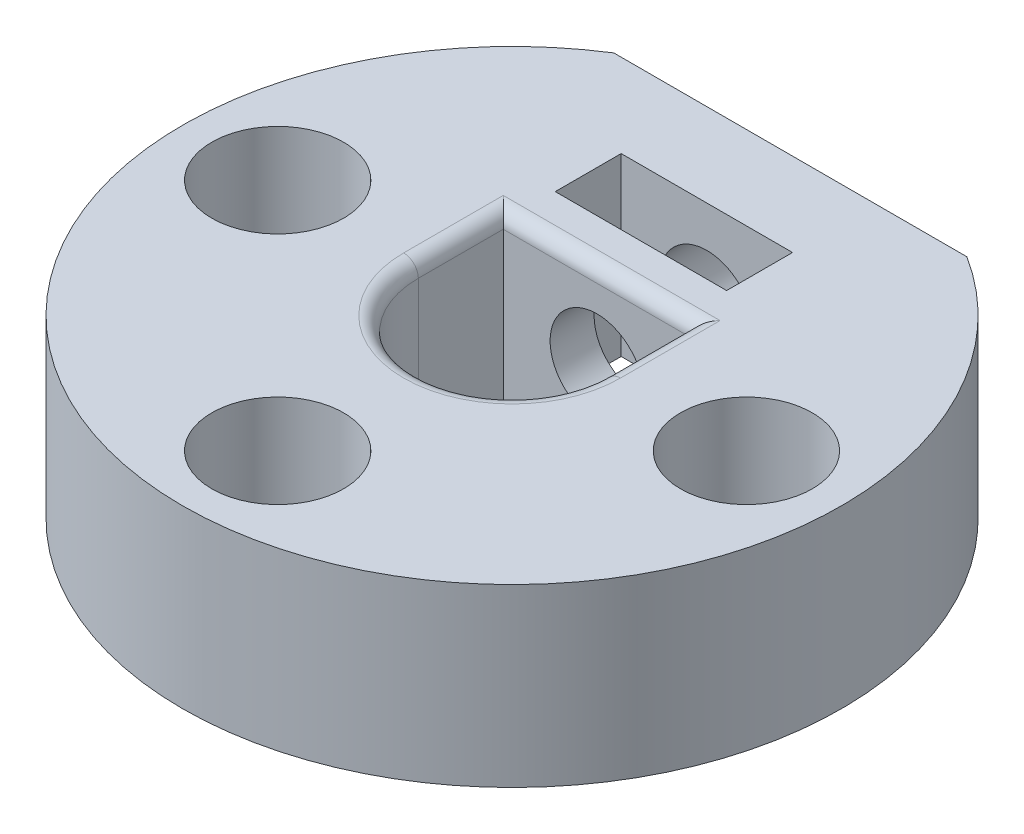
ISO-10303-21;
HEADER;
FILE_DESCRIPTION(('STEP AP214'),'2;1');
FILE_NAME('part.step','',(''),(''),'','','');
FILE_SCHEMA(('AUTOMOTIVE_DESIGN { 1 0 10303 214 1 1 1 1 }'));
ENDSEC;
DATA;
#1=APPLICATION_CONTEXT('core data for automotive mechanical design processes');
#2=APPLICATION_PROTOCOL_DEFINITION('international standard','automotive_design',2000,#1);
#3=PRODUCT_CONTEXT('',#1,'mechanical');
#4=PRODUCT('Part','Part','',(#3));
#5=PRODUCT_RELATED_PRODUCT_CATEGORY('part','',(#4));
#6=PRODUCT_DEFINITION_FORMATION('','',#4);
#7=PRODUCT_DEFINITION_CONTEXT('part definition',#1,'design');
#8=PRODUCT_DEFINITION('design','',#6,#7);
#9=PRODUCT_DEFINITION_SHAPE('','',#8);
#10=(LENGTH_UNIT() NAMED_UNIT(*) SI_UNIT(.MILLI.,.METRE.));
#11=(NAMED_UNIT(*) PLANE_ANGLE_UNIT() SI_UNIT($,.RADIAN.));
#12=(NAMED_UNIT(*) SI_UNIT($,.STERADIAN.) SOLID_ANGLE_UNIT());
#13=UNCERTAINTY_MEASURE_WITH_UNIT(LENGTH_MEASURE(1.E-05),#10,'distance_accuracy_value','');
#14=(GEOMETRIC_REPRESENTATION_CONTEXT(3) GLOBAL_UNCERTAINTY_ASSIGNED_CONTEXT((#13)) GLOBAL_UNIT_ASSIGNED_CONTEXT((#10,
#11,#12)) REPRESENTATION_CONTEXT('',''));
#15=CARTESIAN_POINT('',(0.,0.,0.));
#16=DIRECTION('',(0.,0.,1.));
#17=DIRECTION('',(1.,0.,0.));
#18=AXIS2_PLACEMENT_3D('',#15,#16,#17);
#19=CARTESIAN_POINT('',(0.,6.,0.));
#20=DIRECTION('',(0.,1.,0.));
#21=DIRECTION('',(0.,0.,1.));
#22=AXIS2_PLACEMENT_3D('',#19,#20,#21);
#23=PLANE('',#22);
#24=DIRECTION('',(0.,0.,1.));
#25=VECTOR('',#24,1.);
#26=CARTESIAN_POINT('',(-3.7,6.,0.));
#27=LINE('',#26,#25);
#28=CARTESIAN_POINT('',(-3.7,6.,0.));
#29=VERTEX_POINT('',#28);
#30=CARTESIAN_POINT('',(-3.7,6.,-3.4));
#31=VERTEX_POINT('',#30);
#32=EDGE_CURVE('E249',#29,#31,#27,.F.);
#33=ORIENTED_EDGE('',*,*,#32,.T.);
#34=DIRECTION('',(-1.,0.,0.));
#35=VECTOR('',#34,1.);
#36=CARTESIAN_POINT('',(0.,6.,-3.4));
#37=LINE('',#36,#35);
#38=CARTESIAN_POINT('',(3.7,6.,-3.4));
#39=VERTEX_POINT('',#38);
#40=EDGE_CURVE('E252',#31,#39,#37,.F.);
#41=ORIENTED_EDGE('',*,*,#40,.T.);
#42=DIRECTION('',(0.,0.,-1.));
#43=VECTOR('',#42,1.);
#44=CARTESIAN_POINT('',(3.7,6.,0.));
#45=LINE('',#44,#43);
#46=CARTESIAN_POINT('',(3.7,6.,0.));
#47=VERTEX_POINT('',#46);
#48=EDGE_CURVE('E247',#39,#47,#45,.F.);
#49=ORIENTED_EDGE('',*,*,#48,.T.);
#50=CARTESIAN_POINT('',(0.,6.,0.));
#51=DIRECTION('',(0.,1.,0.));
#52=DIRECTION('',(0.,0.,1.));
#53=AXIS2_PLACEMENT_3D('',#50,#51,#52);
#54=CIRCLE('',#53,3.7);
#55=EDGE_CURVE('E245',#47,#29,#54,.F.);
#56=ORIENTED_EDGE('',*,*,#55,.T.);
#57=EDGE_LOOP('',(#33,#41,#49,#56));
#58=FACE_BOUND('',#57,.T.);
#59=CARTESIAN_POINT('',(8.,6.,0.));
#60=DIRECTION('',(0.,1.,0.));
#61=DIRECTION('',(0.,0.,1.));
#62=AXIS2_PLACEMENT_3D('',#59,#60,#61);
#63=CIRCLE('',#62,2.25);
#64=CARTESIAN_POINT('',(8.,6.,2.25));
#65=VERTEX_POINT('',#64);
#66=EDGE_CURVE('E169',#65,#65,#63,.T.);
#67=ORIENTED_EDGE('',*,*,#66,.F.);
#68=EDGE_LOOP('',(#67));
#69=FACE_BOUND('',#68,.T.);
#70=CARTESIAN_POINT('',(-8.,6.,-1.68080962984129E-13));
#71=DIRECTION('',(0.,1.,0.));
#72=DIRECTION('',(0.,0.,1.));
#73=AXIS2_PLACEMENT_3D('',#70,#71,#72);
#74=CIRCLE('',#73,2.25);
#75=CARTESIAN_POINT('',(-8.,6.,2.24999999999983));
#76=VERTEX_POINT('',#75);
#77=EDGE_CURVE('E182',#76,#76,#74,.T.);
#78=ORIENTED_EDGE('',*,*,#77,.F.);
#79=EDGE_LOOP('',(#78));
#80=FACE_BOUND('',#79,.T.);
#81=CARTESIAN_POINT('',(0.,6.,8.));
#82=DIRECTION('',(0.,1.,0.));
#83=DIRECTION('',(0.,0.,1.));
#84=AXIS2_PLACEMENT_3D('',#81,#82,#83);
#85=CIRCLE('',#84,2.25);
#86=CARTESIAN_POINT('',(0.,6.,10.25));
#87=VERTEX_POINT('',#86);
#88=EDGE_CURVE('E194',#87,#87,#85,.T.);
#89=ORIENTED_EDGE('',*,*,#88,.F.);
#90=EDGE_LOOP('',(#89));
#91=FACE_BOUND('',#90,.T.);
#92=CARTESIAN_POINT('',(0.,6.,0.));
#93=DIRECTION('',(0.,1.,0.));
#94=DIRECTION('',(0.,0.,1.));
#95=AXIS2_PLACEMENT_3D('',#92,#93,#94);
#96=CIRCLE('',#95,11.25);
#97=CARTESIAN_POINT('',(-6.02598539659698,6.,-9.5));
#98=VERTEX_POINT('',#97);
#99=CARTESIAN_POINT('',(6.02598539659698,6.,-9.5));
#100=VERTEX_POINT('',#99);
#101=EDGE_CURVE('E227',#98,#100,#96,.T.);
#102=ORIENTED_EDGE('',*,*,#101,.T.);
#103=DIRECTION('',(-1.,0.,0.));
#104=VECTOR('',#103,1.);
#105=CARTESIAN_POINT('',(6.02598539659698,6.,-9.5));
#106=LINE('',#105,#104);
#107=EDGE_CURVE('E230',#100,#98,#106,.T.);
#108=ORIENTED_EDGE('',*,*,#107,.T.);
#109=EDGE_LOOP('',(#102,#108));
#110=FACE_BOUND('',#109,.T.);
#111=DIRECTION('',(1.,0.,0.));
#112=VECTOR('',#111,1.);
#113=CARTESIAN_POINT('',(0.,6.,-6.65));
#114=LINE('',#113,#112);
#115=CARTESIAN_POINT('',(-2.925,6.,-6.65));
#116=VERTEX_POINT('',#115);
#117=CARTESIAN_POINT('',(2.925,6.,-6.65));
#118=VERTEX_POINT('',#117);
#119=EDGE_CURVE('E159',#116,#118,#114,.T.);
#120=ORIENTED_EDGE('',*,*,#119,.T.);
#121=DIRECTION('',(0.,0.,1.));
#122=VECTOR('',#121,1.);
#123=CARTESIAN_POINT('',(2.925,6.,0.));
#124=LINE('',#123,#122);
#125=CARTESIAN_POINT('',(2.925,6.,-4.4));
#126=VERTEX_POINT('',#125);
#127=EDGE_CURVE('E129',#118,#126,#124,.T.);
#128=ORIENTED_EDGE('',*,*,#127,.T.);
#129=DIRECTION('',(-1.,0.,0.));
#130=VECTOR('',#129,1.);
#131=CARTESIAN_POINT('',(0.,6.,-4.4));
#132=LINE('',#131,#130);
#133=CARTESIAN_POINT('',(-2.925,6.,-4.4));
#134=VERTEX_POINT('',#133);
#135=EDGE_CURVE('E156',#126,#134,#132,.T.);
#136=ORIENTED_EDGE('',*,*,#135,.T.);
#137=DIRECTION('',(0.,0.,-1.));
#138=VECTOR('',#137,1.);
#139=CARTESIAN_POINT('',(-2.925,6.,0.));
#140=LINE('',#139,#138);
#141=EDGE_CURVE('E161',#134,#116,#140,.T.);
#142=ORIENTED_EDGE('',*,*,#141,.T.);
#143=EDGE_LOOP('',(#120,#128,#136,#142));
#144=FACE_BOUND('',#143,.T.);
#145=ADVANCED_FACE('F36',(#58,#69,#80,#91,#110,#144),#23,.T.);
#146=CARTESIAN_POINT('',(0.,0.,0.));
#147=DIRECTION('',(0.,1.,0.));
#148=DIRECTION('',(0.,0.,1.));
#149=AXIS2_PLACEMENT_3D('',#146,#147,#148);
#150=PLANE('',#149);
#151=CARTESIAN_POINT('',(0.,0.,0.));
#152=DIRECTION('',(0.,1.,0.));
#153=DIRECTION('',(0.,0.,1.));
#154=AXIS2_PLACEMENT_3D('',#151,#152,#153);
#155=CIRCLE('',#154,3.2);
#156=CARTESIAN_POINT('',(-3.2,0.,0.));
#157=VERTEX_POINT('',#156);
#158=CARTESIAN_POINT('',(3.2,0.,0.));
#159=VERTEX_POINT('',#158);
#160=EDGE_CURVE('E206',#157,#159,#155,.T.);
#161=ORIENTED_EDGE('',*,*,#160,.T.);
#162=DIRECTION('',(0.,0.,-1.));
#163=VECTOR('',#162,1.);
#164=CARTESIAN_POINT('',(3.2,0.,0.));
#165=LINE('',#164,#163);
#166=CARTESIAN_POINT('',(3.2,0.,-2.9));
#167=VERTEX_POINT('',#166);
#168=EDGE_CURVE('E209',#159,#167,#165,.T.);
#169=ORIENTED_EDGE('',*,*,#168,.T.);
#170=DIRECTION('',(-1.,0.,0.));
#171=VECTOR('',#170,1.);
#172=CARTESIAN_POINT('',(3.2,0.,-2.9));
#173=LINE('',#172,#171);
#174=CARTESIAN_POINT('',(-3.2,0.,-2.9));
#175=VERTEX_POINT('',#174);
#176=EDGE_CURVE('E212',#167,#175,#173,.T.);
#177=ORIENTED_EDGE('',*,*,#176,.T.);
#178=DIRECTION('',(0.,0.,1.));
#179=VECTOR('',#178,1.);
#180=CARTESIAN_POINT('',(-3.2,0.,0.));
#181=LINE('',#180,#179);
#182=EDGE_CURVE('E215',#175,#157,#181,.T.);
#183=ORIENTED_EDGE('',*,*,#182,.T.);
#184=EDGE_LOOP('',(#161,#169,#177,#183));
#185=FACE_BOUND('',#184,.T.);
#186=CARTESIAN_POINT('',(0.,0.,0.));
#187=DIRECTION('',(0.,1.,0.));
#188=DIRECTION('',(0.,0.,1.));
#189=AXIS2_PLACEMENT_3D('',#186,#187,#188);
#190=CIRCLE('',#189,11.25);
#191=CARTESIAN_POINT('',(-6.02598539659698,0.,-9.5));
#192=VERTEX_POINT('',#191);
#193=CARTESIAN_POINT('',(6.02598539659698,0.,-9.5));
#194=VERTEX_POINT('',#193);
#195=EDGE_CURVE('E226',#192,#194,#190,.T.);
#196=ORIENTED_EDGE('',*,*,#195,.F.);
#197=DIRECTION('',(-1.,0.,0.));
#198=VECTOR('',#197,1.);
#199=CARTESIAN_POINT('',(6.02598539659698,0.,-9.5));
#200=LINE('',#199,#198);
#201=EDGE_CURVE('E231',#194,#192,#200,.T.);
#202=ORIENTED_EDGE('',*,*,#201,.F.);
#203=EDGE_LOOP('',(#196,#202));
#204=FACE_BOUND('',#203,.T.);
#205=CARTESIAN_POINT('',(0.,0.,8.));
#206=DIRECTION('',(0.,1.,0.));
#207=DIRECTION('',(0.,0.,1.));
#208=AXIS2_PLACEMENT_3D('',#205,#206,#207);
#209=CIRCLE('',#208,1.25);
#210=CARTESIAN_POINT('',(0.,0.,9.25));
#211=VERTEX_POINT('',#210);
#212=EDGE_CURVE('E203',#211,#211,#209,.T.);
#213=ORIENTED_EDGE('',*,*,#212,.T.);
#214=EDGE_LOOP('',(#213));
#215=FACE_BOUND('',#214,.T.);
#216=CARTESIAN_POINT('',(-8.,0.,-1.68080962984129E-13));
#217=DIRECTION('',(0.,1.,0.));
#218=DIRECTION('',(0.,0.,1.));
#219=AXIS2_PLACEMENT_3D('',#216,#217,#218);
#220=CIRCLE('',#219,1.25);
#221=CARTESIAN_POINT('',(-8.,0.,1.24999999999983));
#222=VERTEX_POINT('',#221);
#223=EDGE_CURVE('E191',#222,#222,#220,.T.);
#224=ORIENTED_EDGE('',*,*,#223,.T.);
#225=EDGE_LOOP('',(#224));
#226=FACE_BOUND('',#225,.T.);
#227=CARTESIAN_POINT('',(8.,0.,0.));
#228=DIRECTION('',(0.,1.,0.));
#229=DIRECTION('',(0.,0.,1.));
#230=AXIS2_PLACEMENT_3D('',#227,#228,#229);
#231=CIRCLE('',#230,1.25);
#232=CARTESIAN_POINT('',(8.,0.,1.25));
#233=VERTEX_POINT('',#232);
#234=EDGE_CURVE('E179',#233,#233,#231,.T.);
#235=ORIENTED_EDGE('',*,*,#234,.T.);
#236=EDGE_LOOP('',(#235));
#237=FACE_BOUND('',#236,.T.);
#238=DIRECTION('',(0.,0.,-1.));
#239=VECTOR('',#238,1.);
#240=CARTESIAN_POINT('',(2.925,0.,-4.4));
#241=LINE('',#240,#239);
#242=CARTESIAN_POINT('',(2.925,0.,-4.4));
#243=VERTEX_POINT('',#242);
#244=CARTESIAN_POINT('',(2.925,0.,-6.65));
#245=VERTEX_POINT('',#244);
#246=EDGE_CURVE('E61',#243,#245,#241,.T.);
#247=ORIENTED_EDGE('',*,*,#246,.T.);
#248=DIRECTION('',(-1.,0.,0.));
#249=VECTOR('',#248,1.);
#250=CARTESIAN_POINT('',(-2.925,0.,-6.65));
#251=LINE('',#250,#249);
#252=CARTESIAN_POINT('',(-2.925,0.,-6.65));
#253=VERTEX_POINT('',#252);
#254=EDGE_CURVE('E136',#245,#253,#251,.T.);
#255=ORIENTED_EDGE('',*,*,#254,.T.);
#256=DIRECTION('',(0.,0.,1.));
#257=VECTOR('',#256,1.);
#258=CARTESIAN_POINT('',(-2.925,0.,-4.4));
#259=LINE('',#258,#257);
#260=CARTESIAN_POINT('',(-2.925,0.,-4.4));
#261=VERTEX_POINT('',#260);
#262=EDGE_CURVE('E143',#253,#261,#259,.T.);
#263=ORIENTED_EDGE('',*,*,#262,.T.);
#264=DIRECTION('',(1.,0.,0.));
#265=VECTOR('',#264,1.);
#266=CARTESIAN_POINT('',(-2.925,0.,-4.4));
#267=LINE('',#266,#265);
#268=EDGE_CURVE('E147',#261,#243,#267,.T.);
#269=ORIENTED_EDGE('',*,*,#268,.T.);
#270=EDGE_LOOP('',(#247,#255,#263,#269));
#271=FACE_BOUND('',#270,.T.);
#272=ADVANCED_FACE('F146',(#185,#204,#215,#226,#237,#271),#150,.F.);
#273=CARTESIAN_POINT('',(0.,3.,-9.5));
#274=DIRECTION('',(0.,0.,1.));
#275=DIRECTION('',(1.,0.,0.));
#276=AXIS2_PLACEMENT_3D('',#273,#274,#275);
#277=CYLINDRICAL_SURFACE('',#276,1.6);
#278=CARTESIAN_POINT('',(0.,3.,-9.5));
#279=DIRECTION('',(0.,0.,1.));
#280=DIRECTION('',(1.,0.,0.));
#281=AXIS2_PLACEMENT_3D('',#278,#279,#280);
#282=CIRCLE('',#281,1.6);
#283=CARTESIAN_POINT('',(1.6,3.,-9.5));
#284=VERTEX_POINT('',#283);
#285=EDGE_CURVE('E165',#284,#284,#282,.T.);
#286=ORIENTED_EDGE('',*,*,#285,.F.);
#287=EDGE_LOOP('',(#286));
#288=FACE_BOUND('',#287,.T.);
#289=CARTESIAN_POINT('',(0.,3.,-6.65));
#290=DIRECTION('',(0.,0.,1.));
#291=DIRECTION('',(1.,0.,0.));
#292=AXIS2_PLACEMENT_3D('',#289,#290,#291);
#293=CIRCLE('',#292,1.6);
#294=CARTESIAN_POINT('',(1.6,3.,-6.65));
#295=VERTEX_POINT('',#294);
#296=EDGE_CURVE('E40',#295,#295,#293,.F.);
#297=ORIENTED_EDGE('',*,*,#296,.F.);
#298=EDGE_LOOP('',(#297));
#299=FACE_BOUND('',#298,.T.);
#300=ADVANCED_FACE('F275',(#288,#299),#277,.F.);
#301=CARTESIAN_POINT('',(0.,3.,-2.9));
#302=DIRECTION('',(0.,0.,1.));
#303=DIRECTION('',(1.,0.,0.));
#304=AXIS2_PLACEMENT_3D('',#301,#302,#303);
#305=CIRCLE('',#304,1.6);
#306=CARTESIAN_POINT('',(1.6,3.,-2.9));
#307=VERTEX_POINT('',#306);
#308=EDGE_CURVE('E168',#307,#307,#305,.T.);
#309=ORIENTED_EDGE('',*,*,#308,.T.);
#310=EDGE_LOOP('',(#309));
#311=FACE_BOUND('',#310,.T.);
#312=CARTESIAN_POINT('',(0.,3.,-4.4));
#313=DIRECTION('',(0.,0.,-1.));
#314=DIRECTION('',(-1.,0.,0.));
#315=AXIS2_PLACEMENT_3D('',#312,#313,#314);
#316=CIRCLE('',#315,1.6);
#317=CARTESIAN_POINT('',(-1.6,3.,-4.4));
#318=VERTEX_POINT('',#317);
#319=EDGE_CURVE('E132',#318,#318,#316,.F.);
#320=ORIENTED_EDGE('',*,*,#319,.F.);
#321=EDGE_LOOP('',(#320));
#322=FACE_BOUND('',#321,.T.);
#323=ADVANCED_FACE('F272',(#311,#322),#277,.F.);
#324=CARTESIAN_POINT('',(0.,6.,0.));
#325=DIRECTION('',(0.,-1.,0.));
#326=DIRECTION('',(0.,0.,-1.));
#327=AXIS2_PLACEMENT_3D('',#324,#325,#326);
#328=CYLINDRICAL_SURFACE('',#327,11.25);
#329=ORIENTED_EDGE('',*,*,#195,.T.);
#330=DIRECTION('',(0.,-1.,0.));
#331=VECTOR('',#330,1.);
#332=CARTESIAN_POINT('',(6.02598539659698,6.,-9.5));
#333=LINE('',#332,#331);
#334=EDGE_CURVE('E239',#100,#194,#333,.T.);
#335=ORIENTED_EDGE('',*,*,#334,.F.);
#336=ORIENTED_EDGE('',*,*,#101,.F.);
#337=DIRECTION('',(0.,-1.,0.));
#338=VECTOR('',#337,1.);
#339=CARTESIAN_POINT('',(-6.02598539659698,6.,-9.5));
#340=LINE('',#339,#338);
#341=EDGE_CURVE('E233',#98,#192,#340,.T.);
#342=ORIENTED_EDGE('',*,*,#341,.T.);
#343=EDGE_LOOP('',(#329,#335,#336,#342));
#344=FACE_BOUND('',#343,.T.);
#345=ADVANCED_FACE('F274',(#344),#328,.T.);
#346=CARTESIAN_POINT('',(6.02598539659698,6.,-9.5));
#347=DIRECTION('',(0.,0.,1.));
#348=DIRECTION('',(1.,0.,0.));
#349=AXIS2_PLACEMENT_3D('',#346,#347,#348);
#350=PLANE('',#349);
#351=ORIENTED_EDGE('',*,*,#285,.T.);
#352=EDGE_LOOP('',(#351));
#353=FACE_BOUND('',#352,.T.);
#354=ORIENTED_EDGE('',*,*,#201,.T.);
#355=ORIENTED_EDGE('',*,*,#341,.F.);
#356=ORIENTED_EDGE('',*,*,#107,.F.);
#357=ORIENTED_EDGE('',*,*,#334,.T.);
#358=EDGE_LOOP('',(#354,#355,#356,#357));
#359=FACE_BOUND('',#358,.T.);
#360=ADVANCED_FACE('F282',(#353,#359),#350,.F.);
#361=CARTESIAN_POINT('',(0.,6.,0.));
#362=DIRECTION('',(0.,-1.,0.));
#363=DIRECTION('',(0.,0.,-1.));
#364=AXIS2_PLACEMENT_3D('',#361,#362,#363);
#365=CYLINDRICAL_SURFACE('',#364,3.2);
#366=DIRECTION('',(0.,-1.,0.));
#367=VECTOR('',#366,1.);
#368=CARTESIAN_POINT('',(-3.2,6.,0.));
#369=LINE('',#368,#367);
#370=CARTESIAN_POINT('',(-3.2,5.5,0.));
#371=VERTEX_POINT('',#370);
#372=EDGE_CURVE('E218',#371,#157,#369,.T.);
#373=ORIENTED_EDGE('',*,*,#372,.F.);
#374=CARTESIAN_POINT('',(0.,5.5,0.));
#375=DIRECTION('',(0.,1.,0.));
#376=DIRECTION('',(0.,0.,1.));
#377=AXIS2_PLACEMENT_3D('',#374,#375,#376);
#378=CIRCLE('',#377,3.2);
#379=CARTESIAN_POINT('',(3.2,5.5,0.));
#380=VERTEX_POINT('',#379);
#381=EDGE_CURVE('E11',#371,#380,#378,.T.);
#382=ORIENTED_EDGE('',*,*,#381,.T.);
#383=DIRECTION('',(0.,-1.,0.));
#384=VECTOR('',#383,1.);
#385=CARTESIAN_POINT('',(3.2,6.,0.));
#386=LINE('',#385,#384);
#387=EDGE_CURVE('E224',#380,#159,#386,.T.);
#388=ORIENTED_EDGE('',*,*,#387,.T.);
#389=ORIENTED_EDGE('',*,*,#160,.F.);
#390=EDGE_LOOP('',(#373,#382,#388,#389));
#391=FACE_BOUND('',#390,.T.);
#392=ADVANCED_FACE('F298',(#391),#365,.F.);
#393=CARTESIAN_POINT('',(3.2,6.,0.));
#394=DIRECTION('',(-1.,0.,0.));
#395=DIRECTION('',(0.,0.,1.));
#396=AXIS2_PLACEMENT_3D('',#393,#394,#395);
#397=PLANE('',#396);
#398=ORIENTED_EDGE('',*,*,#387,.F.);
#399=DIRECTION('',(0.,0.,-1.));
#400=VECTOR('',#399,1.);
#401=CARTESIAN_POINT('',(3.2,5.5,0.));
#402=LINE('',#401,#400);
#403=CARTESIAN_POINT('',(3.2,5.5,-2.9));
#404=VERTEX_POINT('',#403);
#405=EDGE_CURVE('E254',#380,#404,#402,.T.);
#406=ORIENTED_EDGE('',*,*,#405,.T.);
#407=DIRECTION('',(0.,-1.,0.));
#408=VECTOR('',#407,1.);
#409=CARTESIAN_POINT('',(3.2,6.,-2.9));
#410=LINE('',#409,#408);
#411=EDGE_CURVE('E222',#404,#167,#410,.T.);
#412=ORIENTED_EDGE('',*,*,#411,.T.);
#413=ORIENTED_EDGE('',*,*,#168,.F.);
#414=EDGE_LOOP('',(#398,#406,#412,#413));
#415=FACE_BOUND('',#414,.T.);
#416=ADVANCED_FACE('F346',(#415),#397,.T.);
#417=CARTESIAN_POINT('',(3.2,6.,-2.9));
#418=DIRECTION('',(0.,0.,1.));
#419=DIRECTION('',(1.,0.,0.));
#420=AXIS2_PLACEMENT_3D('',#417,#418,#419);
#421=PLANE('',#420);
#422=ORIENTED_EDGE('',*,*,#308,.F.);
#423=EDGE_LOOP('',(#422));
#424=FACE_BOUND('',#423,.T.);
#425=ORIENTED_EDGE('',*,*,#411,.F.);
#426=DIRECTION('',(-1.,0.,0.));
#427=VECTOR('',#426,1.);
#428=CARTESIAN_POINT('',(3.2,5.5,-2.9));
#429=LINE('',#428,#427);
#430=CARTESIAN_POINT('',(-3.2,5.5,-2.9));
#431=VERTEX_POINT('',#430);
#432=EDGE_CURVE('E45',#404,#431,#429,.T.);
#433=ORIENTED_EDGE('',*,*,#432,.T.);
#434=DIRECTION('',(0.,-1.,0.));
#435=VECTOR('',#434,1.);
#436=CARTESIAN_POINT('',(-3.2,6.,-2.9));
#437=LINE('',#436,#435);
#438=EDGE_CURVE('E220',#431,#175,#437,.T.);
#439=ORIENTED_EDGE('',*,*,#438,.T.);
#440=ORIENTED_EDGE('',*,*,#176,.F.);
#441=EDGE_LOOP('',(#425,#433,#439,#440));
#442=FACE_BOUND('',#441,.T.);
#443=ADVANCED_FACE('F344',(#424,#442),#421,.T.);
#444=CARTESIAN_POINT('',(-3.2,6.,0.));
#445=DIRECTION('',(1.,0.,0.));
#446=DIRECTION('',(0.,0.,-1.));
#447=AXIS2_PLACEMENT_3D('',#444,#445,#446);
#448=PLANE('',#447);
#449=ORIENTED_EDGE('',*,*,#438,.F.);
#450=DIRECTION('',(0.,0.,1.));
#451=VECTOR('',#450,1.);
#452=CARTESIAN_POINT('',(-3.2,5.5,0.));
#453=LINE('',#452,#451);
#454=EDGE_CURVE('E242',#431,#371,#453,.T.);
#455=ORIENTED_EDGE('',*,*,#454,.T.);
#456=ORIENTED_EDGE('',*,*,#372,.T.);
#457=ORIENTED_EDGE('',*,*,#182,.F.);
#458=EDGE_LOOP('',(#449,#455,#456,#457));
#459=FACE_BOUND('',#458,.T.);
#460=ADVANCED_FACE('F336',(#459),#448,.T.);
#461=CARTESIAN_POINT('',(0.,6.,8.));
#462=DIRECTION('',(0.,1.,0.));
#463=DIRECTION('',(0.,0.,1.));
#464=AXIS2_PLACEMENT_3D('',#461,#462,#463);
#465=CYLINDRICAL_SURFACE('',#464,1.25);
#466=ORIENTED_EDGE('',*,*,#212,.F.);
#467=EDGE_LOOP('',(#466));
#468=FACE_BOUND('',#467,.T.);
#469=CARTESIAN_POINT('',(0.,2.,8.));
#470=DIRECTION('',(0.,1.,0.));
#471=DIRECTION('',(0.,0.,1.));
#472=AXIS2_PLACEMENT_3D('',#469,#470,#471);
#473=CIRCLE('',#472,1.25);
#474=CARTESIAN_POINT('',(0.,2.,9.25));
#475=VERTEX_POINT('',#474);
#476=EDGE_CURVE('E200',#475,#475,#473,.T.);
#477=ORIENTED_EDGE('',*,*,#476,.T.);
#478=EDGE_LOOP('',(#477));
#479=FACE_BOUND('',#478,.T.);
#480=ADVANCED_FACE('F357',(#468,#479),#465,.F.);
#481=CARTESIAN_POINT('',(1.24999999999997,2.,8.));
#482=DIRECTION('',(0.,-1.,0.));
#483=DIRECTION('',(0.,0.,-1.));
#484=AXIS2_PLACEMENT_3D('',#481,#482,#483);
#485=PLANE('',#484);
#486=ORIENTED_EDGE('',*,*,#476,.F.);
#487=EDGE_LOOP('',(#486));
#488=FACE_BOUND('',#487,.T.);
#489=CARTESIAN_POINT('',(0.,2.,8.));
#490=DIRECTION('',(0.,1.,0.));
#491=DIRECTION('',(0.,0.,1.));
#492=AXIS2_PLACEMENT_3D('',#489,#490,#491);
#493=CIRCLE('',#492,2.25);
#494=CARTESIAN_POINT('',(0.,2.,10.25));
#495=VERTEX_POINT('',#494);
#496=EDGE_CURVE('E197',#495,#495,#493,.T.);
#497=ORIENTED_EDGE('',*,*,#496,.T.);
#498=EDGE_LOOP('',(#497));
#499=FACE_BOUND('',#498,.T.);
#500=ADVANCED_FACE('F360',(#488,#499),#485,.F.);
#501=CARTESIAN_POINT('',(0.,6.,8.));
#502=DIRECTION('',(0.,1.,0.));
#503=DIRECTION('',(0.,0.,1.));
#504=AXIS2_PLACEMENT_3D('',#501,#502,#503);
#505=CYLINDRICAL_SURFACE('',#504,2.25);
#506=ORIENTED_EDGE('',*,*,#496,.F.);
#507=EDGE_LOOP('',(#506));
#508=FACE_BOUND('',#507,.T.);
#509=ORIENTED_EDGE('',*,*,#88,.T.);
#510=EDGE_LOOP('',(#509));
#511=FACE_BOUND('',#510,.T.);
#512=ADVANCED_FACE('F364',(#508,#511),#505,.F.);
#513=CARTESIAN_POINT('',(-8.,6.,-1.68080962984129E-13));
#514=DIRECTION('',(0.,1.,0.));
#515=DIRECTION('',(0.,0.,1.));
#516=AXIS2_PLACEMENT_3D('',#513,#514,#515);
#517=CYLINDRICAL_SURFACE('',#516,1.25);
#518=ORIENTED_EDGE('',*,*,#223,.F.);
#519=EDGE_LOOP('',(#518));
#520=FACE_BOUND('',#519,.T.);
#521=CARTESIAN_POINT('',(-8.,2.,-1.68080962984129E-13));
#522=DIRECTION('',(0.,1.,0.));
#523=DIRECTION('',(0.,0.,1.));
#524=AXIS2_PLACEMENT_3D('',#521,#522,#523);
#525=CIRCLE('',#524,1.25);
#526=CARTESIAN_POINT('',(-8.,2.,1.24999999999983));
#527=VERTEX_POINT('',#526);
#528=EDGE_CURVE('E188',#527,#527,#525,.T.);
#529=ORIENTED_EDGE('',*,*,#528,.T.);
#530=EDGE_LOOP('',(#529));
#531=FACE_BOUND('',#530,.T.);
#532=ADVANCED_FACE('F368',(#520,#531),#517,.F.);
#533=CARTESIAN_POINT('',(-6.75,2.,-1.68080962984129E-13));
#534=DIRECTION('',(0.,-1.,0.));
#535=DIRECTION('',(0.,0.,-1.));
#536=AXIS2_PLACEMENT_3D('',#533,#534,#535);
#537=PLANE('',#536);
#538=ORIENTED_EDGE('',*,*,#528,.F.);
#539=EDGE_LOOP('',(#538));
#540=FACE_BOUND('',#539,.T.);
#541=CARTESIAN_POINT('',(-8.,2.,-1.68080962984129E-13));
#542=DIRECTION('',(0.,1.,0.));
#543=DIRECTION('',(0.,0.,1.));
#544=AXIS2_PLACEMENT_3D('',#541,#542,#543);
#545=CIRCLE('',#544,2.25);
#546=CARTESIAN_POINT('',(-8.,2.,2.24999999999983));
#547=VERTEX_POINT('',#546);
#548=EDGE_CURVE('E185',#547,#547,#545,.T.);
#549=ORIENTED_EDGE('',*,*,#548,.T.);
#550=EDGE_LOOP('',(#549));
#551=FACE_BOUND('',#550,.T.);
#552=ADVANCED_FACE('F372',(#540,#551),#537,.F.);
#553=CARTESIAN_POINT('',(-8.,6.,-1.68080962984129E-13));
#554=DIRECTION('',(0.,1.,0.));
#555=DIRECTION('',(0.,0.,1.));
#556=AXIS2_PLACEMENT_3D('',#553,#554,#555);
#557=CYLINDRICAL_SURFACE('',#556,2.25);
#558=ORIENTED_EDGE('',*,*,#548,.F.);
#559=EDGE_LOOP('',(#558));
#560=FACE_BOUND('',#559,.T.);
#561=ORIENTED_EDGE('',*,*,#77,.T.);
#562=EDGE_LOOP('',(#561));
#563=FACE_BOUND('',#562,.T.);
#564=ADVANCED_FACE('F376',(#560,#563),#557,.F.);
#565=CARTESIAN_POINT('',(8.,6.,0.));
#566=DIRECTION('',(0.,1.,0.));
#567=DIRECTION('',(0.,0.,1.));
#568=AXIS2_PLACEMENT_3D('',#565,#566,#567);
#569=CYLINDRICAL_SURFACE('',#568,1.25);
#570=ORIENTED_EDGE('',*,*,#234,.F.);
#571=EDGE_LOOP('',(#570));
#572=FACE_BOUND('',#571,.T.);
#573=CARTESIAN_POINT('',(8.,2.,0.));
#574=DIRECTION('',(0.,1.,0.));
#575=DIRECTION('',(0.,0.,1.));
#576=AXIS2_PLACEMENT_3D('',#573,#574,#575);
#577=CIRCLE('',#576,1.25);
#578=CARTESIAN_POINT('',(8.,2.,1.25));
#579=VERTEX_POINT('',#578);
#580=EDGE_CURVE('E176',#579,#579,#577,.T.);
#581=ORIENTED_EDGE('',*,*,#580,.T.);
#582=EDGE_LOOP('',(#581));
#583=FACE_BOUND('',#582,.T.);
#584=ADVANCED_FACE('F380',(#572,#583),#569,.F.);
#585=CARTESIAN_POINT('',(9.25,2.,0.));
#586=DIRECTION('',(0.,-1.,0.));
#587=DIRECTION('',(0.,0.,-1.));
#588=AXIS2_PLACEMENT_3D('',#585,#586,#587);
#589=PLANE('',#588);
#590=ORIENTED_EDGE('',*,*,#580,.F.);
#591=EDGE_LOOP('',(#590));
#592=FACE_BOUND('',#591,.T.);
#593=CARTESIAN_POINT('',(8.,2.,0.));
#594=DIRECTION('',(0.,1.,0.));
#595=DIRECTION('',(0.,0.,1.));
#596=AXIS2_PLACEMENT_3D('',#593,#594,#595);
#597=CIRCLE('',#596,2.25);
#598=CARTESIAN_POINT('',(8.,2.,2.25));
#599=VERTEX_POINT('',#598);
#600=EDGE_CURVE('E172',#599,#599,#597,.T.);
#601=ORIENTED_EDGE('',*,*,#600,.T.);
#602=EDGE_LOOP('',(#601));
#603=FACE_BOUND('',#602,.T.);
#604=ADVANCED_FACE('F384',(#592,#603),#589,.F.);
#605=CARTESIAN_POINT('',(8.,6.,0.));
#606=DIRECTION('',(0.,1.,0.));
#607=DIRECTION('',(0.,0.,1.));
#608=AXIS2_PLACEMENT_3D('',#605,#606,#607);
#609=CYLINDRICAL_SURFACE('',#608,2.25);
#610=ORIENTED_EDGE('',*,*,#600,.F.);
#611=EDGE_LOOP('',(#610));
#612=FACE_BOUND('',#611,.T.);
#613=ORIENTED_EDGE('',*,*,#66,.T.);
#614=EDGE_LOOP('',(#613));
#615=FACE_BOUND('',#614,.T.);
#616=ADVANCED_FACE('F317',(#612,#615),#609,.F.);
#617=CARTESIAN_POINT('',(3.7,5.5,0.));
#618=DIRECTION('',(0.,0.,-1.));
#619=DIRECTION('',(-1.,0.,0.));
#620=AXIS2_PLACEMENT_3D('',#617,#618,#619);
#621=CYLINDRICAL_SURFACE('',#620,0.5);
#622=CARTESIAN_POINT('',(3.7,5.5,0.));
#623=DIRECTION('',(0.,0.,1.));
#624=DIRECTION('',(1.,0.,0.));
#625=AXIS2_PLACEMENT_3D('',#622,#623,#624);
#626=CIRCLE('',#625,0.5);
#627=EDGE_CURVE('E261',#47,#380,#626,.T.);
#628=ORIENTED_EDGE('',*,*,#627,.F.);
#629=ORIENTED_EDGE('',*,*,#48,.F.);
#630=CARTESIAN_POINT('',(3.7,5.5,-3.4));
#631=DIRECTION('',(-0.707106781186548,0.,-0.707106781186547));
#632=DIRECTION('',(0.707106781186547,0.,-0.707106781186548));
#633=AXIS2_PLACEMENT_3D('',#630,#631,#632);
#634=ELLIPSE('',#633,0.707106781186547,0.5);
#635=EDGE_CURVE('E173',#404,#39,#634,.T.);
#636=ORIENTED_EDGE('',*,*,#635,.F.);
#637=ORIENTED_EDGE('',*,*,#405,.F.);
#638=EDGE_LOOP('',(#628,#629,#636,#637));
#639=FACE_BOUND('',#638,.T.);
#640=ADVANCED_FACE('F38',(#639),#621,.T.);
#641=CARTESIAN_POINT('',(3.2,5.5,-3.4));
#642=DIRECTION('',(-1.,0.,0.));
#643=DIRECTION('',(0.,0.,1.));
#644=AXIS2_PLACEMENT_3D('',#641,#642,#643);
#645=CYLINDRICAL_SURFACE('',#644,0.5);
#646=ORIENTED_EDGE('',*,*,#635,.T.);
#647=ORIENTED_EDGE('',*,*,#40,.F.);
#648=CARTESIAN_POINT('',(-3.7,5.5,-3.4));
#649=DIRECTION('',(-0.707106781186548,0.,0.707106781186547));
#650=DIRECTION('',(0.707106781186547,0.,0.707106781186548));
#651=AXIS2_PLACEMENT_3D('',#648,#649,#650);
#652=ELLIPSE('',#651,0.707106781186547,0.5);
#653=EDGE_CURVE('E259',#431,#31,#652,.T.);
#654=ORIENTED_EDGE('',*,*,#653,.F.);
#655=ORIENTED_EDGE('',*,*,#432,.F.);
#656=EDGE_LOOP('',(#646,#647,#654,#655));
#657=FACE_BOUND('',#656,.T.);
#658=ADVANCED_FACE('F310',(#657),#645,.T.);
#659=CARTESIAN_POINT('',(0.,5.5,0.));
#660=DIRECTION('',(0.,1.,0.));
#661=DIRECTION('',(0.,0.,1.));
#662=AXIS2_PLACEMENT_3D('',#659,#660,#661);
#663=TOROIDAL_SURFACE('',#662,3.7,0.5);
#664=ORIENTED_EDGE('',*,*,#627,.T.);
#665=ORIENTED_EDGE('',*,*,#381,.F.);
#666=CARTESIAN_POINT('',(-3.7,5.5,0.));
#667=DIRECTION('',(0.,0.,-1.));
#668=DIRECTION('',(-1.,0.,0.));
#669=AXIS2_PLACEMENT_3D('',#666,#667,#668);
#670=CIRCLE('',#669,0.5);
#671=EDGE_CURVE('E257',#29,#371,#670,.T.);
#672=ORIENTED_EDGE('',*,*,#671,.F.);
#673=ORIENTED_EDGE('',*,*,#55,.F.);
#674=EDGE_LOOP('',(#664,#665,#672,#673));
#675=FACE_BOUND('',#674,.T.);
#676=ADVANCED_FACE('F307',(#675),#663,.T.);
#677=CARTESIAN_POINT('',(-3.7,5.5,0.));
#678=DIRECTION('',(0.,0.,1.));
#679=DIRECTION('',(1.,0.,0.));
#680=AXIS2_PLACEMENT_3D('',#677,#678,#679);
#681=CYLINDRICAL_SURFACE('',#680,0.5);
#682=ORIENTED_EDGE('',*,*,#653,.T.);
#683=ORIENTED_EDGE('',*,*,#32,.F.);
#684=ORIENTED_EDGE('',*,*,#671,.T.);
#685=ORIENTED_EDGE('',*,*,#454,.F.);
#686=EDGE_LOOP('',(#682,#683,#684,#685));
#687=FACE_BOUND('',#686,.T.);
#688=ADVANCED_FACE('F304',(#687),#681,.T.);
#689=CARTESIAN_POINT('',(-2.925,7.25,-6.65));
#690=DIRECTION('',(0.,0.,1.));
#691=DIRECTION('',(1.,0.,0.));
#692=AXIS2_PLACEMENT_3D('',#689,#690,#691);
#693=PLANE('',#692);
#694=DIRECTION('',(0.,-1.,0.));
#695=VECTOR('',#694,1.);
#696=CARTESIAN_POINT('',(-2.925,7.25,-6.65));
#697=LINE('',#696,#695);
#698=EDGE_CURVE('E133',#116,#253,#697,.T.);
#699=ORIENTED_EDGE('',*,*,#698,.T.);
#700=ORIENTED_EDGE('',*,*,#254,.F.);
#701=DIRECTION('',(0.,-1.,0.));
#702=VECTOR('',#701,1.);
#703=CARTESIAN_POINT('',(2.925,7.25,-6.65));
#704=LINE('',#703,#702);
#705=EDGE_CURVE('E125',#118,#245,#704,.T.);
#706=ORIENTED_EDGE('',*,*,#705,.F.);
#707=ORIENTED_EDGE('',*,*,#119,.F.);
#708=EDGE_LOOP('',(#699,#700,#706,#707));
#709=FACE_BOUND('',#708,.T.);
#710=ORIENTED_EDGE('',*,*,#296,.T.);
#711=EDGE_LOOP('',(#710));
#712=FACE_BOUND('',#711,.T.);
#713=ADVANCED_FACE('F137',(#709,#712),#693,.T.);
#714=CARTESIAN_POINT('',(-2.925,7.25,-4.4));
#715=DIRECTION('',(0.,0.,-1.));
#716=DIRECTION('',(-1.,0.,0.));
#717=AXIS2_PLACEMENT_3D('',#714,#715,#716);
#718=PLANE('',#717);
#719=DIRECTION('',(0.,-1.,0.));
#720=VECTOR('',#719,1.);
#721=CARTESIAN_POINT('',(2.925,7.25,-4.4));
#722=LINE('',#721,#720);
#723=EDGE_CURVE('E152',#126,#243,#722,.T.);
#724=ORIENTED_EDGE('',*,*,#723,.T.);
#725=ORIENTED_EDGE('',*,*,#268,.F.);
#726=DIRECTION('',(0.,-1.,0.));
#727=VECTOR('',#726,1.);
#728=CARTESIAN_POINT('',(-2.925,7.25,-4.4));
#729=LINE('',#728,#727);
#730=EDGE_CURVE('E53',#134,#261,#729,.T.);
#731=ORIENTED_EDGE('',*,*,#730,.F.);
#732=ORIENTED_EDGE('',*,*,#135,.F.);
#733=EDGE_LOOP('',(#724,#725,#731,#732));
#734=FACE_BOUND('',#733,.T.);
#735=ORIENTED_EDGE('',*,*,#319,.T.);
#736=EDGE_LOOP('',(#735));
#737=FACE_BOUND('',#736,.T.);
#738=ADVANCED_FACE('F270',(#734,#737),#718,.T.);
#739=CARTESIAN_POINT('',(2.925,7.25,-4.4));
#740=DIRECTION('',(-1.,0.,0.));
#741=DIRECTION('',(0.,0.,1.));
#742=AXIS2_PLACEMENT_3D('',#739,#740,#741);
#743=PLANE('',#742);
#744=ORIENTED_EDGE('',*,*,#705,.T.);
#745=ORIENTED_EDGE('',*,*,#246,.F.);
#746=ORIENTED_EDGE('',*,*,#723,.F.);
#747=ORIENTED_EDGE('',*,*,#127,.F.);
#748=EDGE_LOOP('',(#744,#745,#746,#747));
#749=FACE_BOUND('',#748,.T.);
#750=ADVANCED_FACE('F127',(#749),#743,.T.);
#751=CARTESIAN_POINT('',(-2.925,7.25,-4.4));
#752=DIRECTION('',(1.,0.,0.));
#753=DIRECTION('',(0.,0.,-1.));
#754=AXIS2_PLACEMENT_3D('',#751,#752,#753);
#755=PLANE('',#754);
#756=ORIENTED_EDGE('',*,*,#730,.T.);
#757=ORIENTED_EDGE('',*,*,#262,.F.);
#758=ORIENTED_EDGE('',*,*,#698,.F.);
#759=ORIENTED_EDGE('',*,*,#141,.F.);
#760=EDGE_LOOP('',(#756,#757,#758,#759));
#761=FACE_BOUND('',#760,.T.);
#762=ADVANCED_FACE('F404',(#761),#755,.T.);
#763=CLOSED_SHELL('',(#145,#272,#300,#323,#345,#360,#392,#416,#443,#460,#480,#500,#512,#532,
#552,#564,#584,#604,#616,#640,#658,#676,#688,#713,#738,#750,#762));
#764=MANIFOLD_SOLID_BREP('B2',#763);
#765=ADVANCED_BREP_SHAPE_REPRESENTATION('',(#18,#764),#14);
#766=SHAPE_DEFINITION_REPRESENTATION(#9,#765);
ENDSEC;
END-ISO-10303-21;
